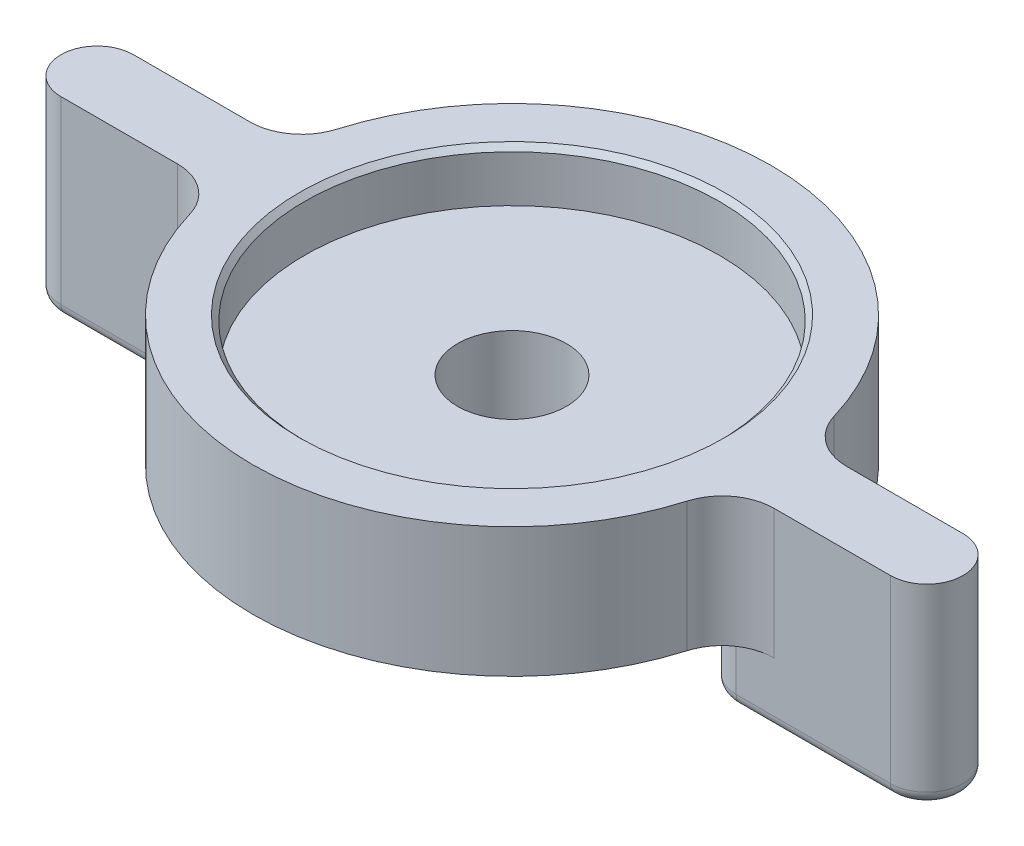
ISO-10303-21;
HEADER;
FILE_DESCRIPTION(('STEP AP214'),'2;1');
FILE_NAME('part.step','',(''),(''),'','','');
FILE_SCHEMA(('AUTOMOTIVE_DESIGN { 1 0 10303 214 1 1 1 1 }'));
ENDSEC;
DATA;
#1=APPLICATION_CONTEXT('core data for automotive mechanical design processes');
#2=APPLICATION_PROTOCOL_DEFINITION('international standard','automotive_design',2000,#1);
#3=PRODUCT_CONTEXT('',#1,'mechanical');
#4=PRODUCT('Part','Part','',(#3));
#5=PRODUCT_RELATED_PRODUCT_CATEGORY('part','',(#4));
#6=PRODUCT_DEFINITION_FORMATION('','',#4);
#7=PRODUCT_DEFINITION_CONTEXT('part definition',#1,'design');
#8=PRODUCT_DEFINITION('design','',#6,#7);
#9=PRODUCT_DEFINITION_SHAPE('','',#8);
#10=(LENGTH_UNIT() NAMED_UNIT(*) SI_UNIT(.MILLI.,.METRE.));
#11=(NAMED_UNIT(*) PLANE_ANGLE_UNIT() SI_UNIT($,.RADIAN.));
#12=(NAMED_UNIT(*) SI_UNIT($,.STERADIAN.) SOLID_ANGLE_UNIT());
#13=UNCERTAINTY_MEASURE_WITH_UNIT(LENGTH_MEASURE(1.E-05),#10,'distance_accuracy_value','');
#14=(GEOMETRIC_REPRESENTATION_CONTEXT(3) GLOBAL_UNCERTAINTY_ASSIGNED_CONTEXT((#13)) GLOBAL_UNIT_ASSIGNED_CONTEXT((#10,
#11,#12)) REPRESENTATION_CONTEXT('',''));
#15=CARTESIAN_POINT('',(0.,0.,0.));
#16=DIRECTION('',(0.,0.,1.));
#17=DIRECTION('',(1.,0.,0.));
#18=AXIS2_PLACEMENT_3D('',#15,#16,#17);
#19=CARTESIAN_POINT('',(-11.5082579046526,3.,3.4));
#20=DIRECTION('',(0.,-1.,0.));
#21=DIRECTION('',(0.,0.,-1.));
#22=AXIS2_PLACEMENT_3D('',#19,#20,#21);
#23=CYLINDRICAL_SURFACE('',#22,2.);
#24=DIRECTION('',(0.,1.,0.));
#25=VECTOR('',#24,1.);
#26=CARTESIAN_POINT('',(-11.5082579046526,3.,1.4));
#27=LINE('',#26,#25);
#28=CARTESIAN_POINT('',(-11.5082579046526,0.,1.4));
#29=VERTEX_POINT('',#28);
#30=CARTESIAN_POINT('',(-11.5082579046524,5.,1.4));
#31=VERTEX_POINT('',#30);
#32=EDGE_CURVE('E287',#29,#31,#27,.T.);
#33=ORIENTED_EDGE('',*,*,#32,.F.);
#34=CARTESIAN_POINT('',(-11.5082579046526,0.,3.4));
#35=DIRECTION('',(0.,1.,0.));
#36=DIRECTION('',(0.,0.,1.));
#37=AXIS2_PLACEMENT_3D('',#34,#35,#36);
#38=CIRCLE('',#37,2.);
#39=CARTESIAN_POINT('',(-9.59021492054387,0.,2.83333333333334));
#40=VERTEX_POINT('',#39);
#41=EDGE_CURVE('E293',#29,#40,#38,.F.);
#42=ORIENTED_EDGE('',*,*,#41,.T.);
#43=DIRECTION('',(0.,-1.,0.));
#44=VECTOR('',#43,1.);
#45=CARTESIAN_POINT('',(-9.59021492054387,3.,2.83333333333333));
#46=LINE('',#45,#44);
#47=CARTESIAN_POINT('',(-9.59021492054387,5.,2.83333333333334));
#48=VERTEX_POINT('',#47);
#49=EDGE_CURVE('E290',#48,#40,#46,.T.);
#50=ORIENTED_EDGE('',*,*,#49,.F.);
#51=CARTESIAN_POINT('',(-11.5082579046526,5.,3.4));
#52=DIRECTION('',(0.,1.,0.));
#53=DIRECTION('',(0.,0.,1.));
#54=AXIS2_PLACEMENT_3D('',#51,#52,#53);
#55=CIRCLE('',#54,2.);
#56=EDGE_CURVE('E295',#48,#31,#55,.T.);
#57=ORIENTED_EDGE('',*,*,#56,.T.);
#58=EDGE_LOOP('',(#33,#42,#50,#57));
#59=FACE_BOUND('',#58,.T.);
#60=ADVANCED_FACE('F33',(#59),#23,.F.);
#61=CARTESIAN_POINT('',(-11.5082579046526,3.,-3.4));
#62=DIRECTION('',(0.,-1.,0.));
#63=DIRECTION('',(0.,0.,-1.));
#64=AXIS2_PLACEMENT_3D('',#61,#62,#63);
#65=CYLINDRICAL_SURFACE('',#64,2.);
#66=DIRECTION('',(0.,-1.,0.));
#67=VECTOR('',#66,1.);
#68=CARTESIAN_POINT('',(-9.59021492054387,3.,-2.83333333333333));
#69=LINE('',#68,#67);
#70=CARTESIAN_POINT('',(-9.59021492054387,0.,-2.83333333333334));
#71=VERTEX_POINT('',#70);
#72=CARTESIAN_POINT('',(-9.59021492054387,5.,-2.83333333333334));
#73=VERTEX_POINT('',#72);
#74=EDGE_CURVE('E271',#71,#73,#69,.F.);
#75=ORIENTED_EDGE('',*,*,#74,.F.);
#76=CARTESIAN_POINT('',(-11.5082579046526,0.,-3.4));
#77=DIRECTION('',(0.,1.,0.));
#78=DIRECTION('',(0.,0.,1.));
#79=AXIS2_PLACEMENT_3D('',#76,#77,#78);
#80=CIRCLE('',#79,2.);
#81=CARTESIAN_POINT('',(-11.5082579046526,0.,-1.4));
#82=VERTEX_POINT('',#81);
#83=EDGE_CURVE('E280',#71,#82,#80,.F.);
#84=ORIENTED_EDGE('',*,*,#83,.T.);
#85=DIRECTION('',(0.,1.,0.));
#86=VECTOR('',#85,1.);
#87=CARTESIAN_POINT('',(-11.5082579046526,3.,-1.4));
#88=LINE('',#87,#86);
#89=CARTESIAN_POINT('',(-11.5082579046526,5.,-1.4));
#90=VERTEX_POINT('',#89);
#91=EDGE_CURVE('E277',#90,#82,#88,.F.);
#92=ORIENTED_EDGE('',*,*,#91,.F.);
#93=CARTESIAN_POINT('',(-11.5082579046526,5.,-3.4));
#94=DIRECTION('',(0.,1.,0.));
#95=DIRECTION('',(0.,0.,1.));
#96=AXIS2_PLACEMENT_3D('',#93,#94,#95);
#97=CIRCLE('',#96,2.);
#98=EDGE_CURVE('E282',#90,#73,#97,.T.);
#99=ORIENTED_EDGE('',*,*,#98,.T.);
#100=EDGE_LOOP('',(#75,#84,#92,#99));
#101=FACE_BOUND('',#100,.T.);
#102=ADVANCED_FACE('F366',(#101),#65,.F.);
#103=CARTESIAN_POINT('',(11.5082579046526,3.,3.4));
#104=DIRECTION('',(0.,-1.,0.));
#105=DIRECTION('',(0.,0.,-1.));
#106=AXIS2_PLACEMENT_3D('',#103,#104,#105);
#107=CYLINDRICAL_SURFACE('',#106,2.);
#108=DIRECTION('',(0.,1.,0.));
#109=VECTOR('',#108,1.);
#110=CARTESIAN_POINT('',(11.5082579046526,3.,1.4));
#111=LINE('',#110,#109);
#112=CARTESIAN_POINT('',(11.5082579046526,5.,1.4));
#113=VERTEX_POINT('',#112);
#114=CARTESIAN_POINT('',(11.5082579046526,0.,1.4));
#115=VERTEX_POINT('',#114);
#116=EDGE_CURVE('E191',#113,#115,#111,.F.);
#117=ORIENTED_EDGE('',*,*,#116,.F.);
#118=CARTESIAN_POINT('',(11.5082579046526,5.,3.4));
#119=DIRECTION('',(0.,1.,0.));
#120=DIRECTION('',(0.,0.,1.));
#121=AXIS2_PLACEMENT_3D('',#118,#119,#120);
#122=CIRCLE('',#121,2.);
#123=CARTESIAN_POINT('',(9.59021492054387,5.,2.83333333333333));
#124=VERTEX_POINT('',#123);
#125=EDGE_CURVE('E266',#113,#124,#122,.T.);
#126=ORIENTED_EDGE('',*,*,#125,.T.);
#127=DIRECTION('',(0.,-1.,0.));
#128=VECTOR('',#127,1.);
#129=CARTESIAN_POINT('',(9.59021492054387,3.,2.83333333333333));
#130=LINE('',#129,#128);
#131=CARTESIAN_POINT('',(9.59021492054387,0.,2.83333333333333));
#132=VERTEX_POINT('',#131);
#133=EDGE_CURVE('E263',#132,#124,#130,.F.);
#134=ORIENTED_EDGE('',*,*,#133,.F.);
#135=CARTESIAN_POINT('',(11.5082579046526,0.,3.4));
#136=DIRECTION('',(0.,1.,0.));
#137=DIRECTION('',(0.,0.,1.));
#138=AXIS2_PLACEMENT_3D('',#135,#136,#137);
#139=CIRCLE('',#138,2.);
#140=EDGE_CURVE('E269',#132,#115,#139,.F.);
#141=ORIENTED_EDGE('',*,*,#140,.T.);
#142=EDGE_LOOP('',(#117,#126,#134,#141));
#143=FACE_BOUND('',#142,.T.);
#144=ADVANCED_FACE('F372',(#143),#107,.F.);
#145=CARTESIAN_POINT('',(11.5082579046526,3.,-3.4));
#146=DIRECTION('',(0.,-1.,0.));
#147=DIRECTION('',(0.,0.,-1.));
#148=AXIS2_PLACEMENT_3D('',#145,#146,#147);
#149=CYLINDRICAL_SURFACE('',#148,2.);
#150=DIRECTION('',(0.,-1.,0.));
#151=VECTOR('',#150,1.);
#152=CARTESIAN_POINT('',(9.59021492054387,3.,-2.83333333333333));
#153=LINE('',#152,#151);
#154=CARTESIAN_POINT('',(9.59021492054387,5.,-2.83333333333333));
#155=VERTEX_POINT('',#154);
#156=CARTESIAN_POINT('',(9.59021492054387,0.,-2.83333333333333));
#157=VERTEX_POINT('',#156);
#158=EDGE_CURVE('E252',#155,#157,#153,.T.);
#159=ORIENTED_EDGE('',*,*,#158,.F.);
#160=CARTESIAN_POINT('',(11.5082579046526,5.,-3.4));
#161=DIRECTION('',(0.,1.,0.));
#162=DIRECTION('',(0.,0.,1.));
#163=AXIS2_PLACEMENT_3D('',#160,#161,#162);
#164=CIRCLE('',#163,2.);
#165=CARTESIAN_POINT('',(11.5082579046524,5.,-1.4));
#166=VERTEX_POINT('',#165);
#167=EDGE_CURVE('E259',#155,#166,#164,.T.);
#168=ORIENTED_EDGE('',*,*,#167,.T.);
#169=DIRECTION('',(0.,1.,0.));
#170=VECTOR('',#169,1.);
#171=CARTESIAN_POINT('',(11.5082579046526,3.,-1.4));
#172=LINE('',#171,#170);
#173=CARTESIAN_POINT('',(11.5082579046526,0.,-1.4));
#174=VERTEX_POINT('',#173);
#175=EDGE_CURVE('E256',#174,#166,#172,.T.);
#176=ORIENTED_EDGE('',*,*,#175,.F.);
#177=CARTESIAN_POINT('',(11.5082579046526,0.,-3.4));
#178=DIRECTION('',(0.,1.,0.));
#179=DIRECTION('',(0.,0.,1.));
#180=AXIS2_PLACEMENT_3D('',#177,#178,#179);
#181=CIRCLE('',#180,2.);
#182=EDGE_CURVE('E194',#174,#157,#181,.F.);
#183=ORIENTED_EDGE('',*,*,#182,.T.);
#184=EDGE_LOOP('',(#159,#168,#176,#183));
#185=FACE_BOUND('',#184,.T.);
#186=ADVANCED_FACE('F465',(#185),#149,.F.);
#187=CARTESIAN_POINT('',(0.,3.,0.));
#188=DIRECTION('',(0.,1.,0.));
#189=DIRECTION('',(0.,0.,1.));
#190=AXIS2_PLACEMENT_3D('',#187,#188,#189);
#191=PLANE('',#190);
#192=CARTESIAN_POINT('',(0.,3.,0.));
#193=DIRECTION('',(0.,1.,0.));
#194=DIRECTION('',(0.,0.,1.));
#195=AXIS2_PLACEMENT_3D('',#192,#193,#194);
#196=CIRCLE('',#195,2.1);
#197=CARTESIAN_POINT('',(0.,3.,2.1));
#198=VERTEX_POINT('',#197);
#199=EDGE_CURVE('E241',#198,#198,#196,.T.);
#200=ORIENTED_EDGE('',*,*,#199,.F.);
#201=EDGE_LOOP('',(#200));
#202=FACE_BOUND('',#201,.T.);
#203=CARTESIAN_POINT('',(0.,3.,0.));
#204=DIRECTION('',(0.,1.,0.));
#205=DIRECTION('',(0.,0.,1.));
#206=AXIS2_PLACEMENT_3D('',#203,#204,#205);
#207=CIRCLE('',#206,8.);
#208=CARTESIAN_POINT('',(0.,3.,8.));
#209=VERTEX_POINT('',#208);
#210=EDGE_CURVE('E249',#209,#209,#207,.F.);
#211=ORIENTED_EDGE('',*,*,#210,.F.);
#212=EDGE_LOOP('',(#211));
#213=FACE_BOUND('',#212,.T.);
#214=ADVANCED_FACE('F462',(#202,#213),#191,.T.);
#215=CARTESIAN_POINT('',(0.,0.,0.));
#216=DIRECTION('',(0.,1.,0.));
#217=DIRECTION('',(0.,0.,1.));
#218=AXIS2_PLACEMENT_3D('',#215,#216,#217);
#219=PLANE('',#218);
#220=CARTESIAN_POINT('',(-10.05,0.,0.));
#221=DIRECTION('',(0.,-1.,0.));
#222=DIRECTION('',(0.,0.,-1.));
#223=AXIS2_PLACEMENT_3D('',#220,#221,#222);
#224=CIRCLE('',#223,1.4);
#225=CARTESIAN_POINT('',(-10.05,0.,-1.4));
#226=VERTEX_POINT('',#225);
#227=CARTESIAN_POINT('',(-10.05,0.,1.4));
#228=VERTEX_POINT('',#227);
#229=EDGE_CURVE('E209',#226,#228,#224,.T.);
#230=ORIENTED_EDGE('',*,*,#229,.F.);
#231=DIRECTION('',(1.,0.,0.));
#232=VECTOR('',#231,1.);
#233=CARTESIAN_POINT('',(0.,0.,-1.4));
#234=LINE('',#233,#232);
#235=EDGE_CURVE('E274',#82,#226,#234,.T.);
#236=ORIENTED_EDGE('',*,*,#235,.F.);
#237=ORIENTED_EDGE('',*,*,#83,.F.);
#238=CARTESIAN_POINT('',(0.,0.,0.));
#239=DIRECTION('',(0.,1.,0.));
#240=DIRECTION('',(0.,0.,1.));
#241=AXIS2_PLACEMENT_3D('',#238,#239,#240);
#242=CIRCLE('',#241,10.);
#243=EDGE_CURVE('E244',#157,#71,#242,.T.);
#244=ORIENTED_EDGE('',*,*,#243,.F.);
#245=ORIENTED_EDGE('',*,*,#182,.F.);
#246=DIRECTION('',(1.,0.,0.));
#247=VECTOR('',#246,1.);
#248=CARTESIAN_POINT('',(0.,0.,-1.4));
#249=LINE('',#248,#247);
#250=CARTESIAN_POINT('',(10.05,0.,-1.4));
#251=VERTEX_POINT('',#250);
#252=EDGE_CURVE('E201',#251,#174,#249,.T.);
#253=ORIENTED_EDGE('',*,*,#252,.F.);
#254=CARTESIAN_POINT('',(10.05,0.,0.));
#255=DIRECTION('',(0.,-1.,0.));
#256=DIRECTION('',(0.,0.,1.));
#257=AXIS2_PLACEMENT_3D('',#254,#255,#256);
#258=CIRCLE('',#257,1.4);
#259=CARTESIAN_POINT('',(10.05,0.,1.4));
#260=VERTEX_POINT('',#259);
#261=EDGE_CURVE('E178',#260,#251,#258,.T.);
#262=ORIENTED_EDGE('',*,*,#261,.F.);
#263=DIRECTION('',(-1.,0.,0.));
#264=VECTOR('',#263,1.);
#265=CARTESIAN_POINT('',(0.,0.,1.4));
#266=LINE('',#265,#264);
#267=EDGE_CURVE('E187',#115,#260,#266,.T.);
#268=ORIENTED_EDGE('',*,*,#267,.F.);
#269=ORIENTED_EDGE('',*,*,#140,.F.);
#270=EDGE_CURVE('E247',#40,#132,#242,.T.);
#271=ORIENTED_EDGE('',*,*,#270,.F.);
#272=ORIENTED_EDGE('',*,*,#41,.F.);
#273=DIRECTION('',(-1.,0.,0.));
#274=VECTOR('',#273,1.);
#275=CARTESIAN_POINT('',(0.,0.,1.4));
#276=LINE('',#275,#274);
#277=EDGE_CURVE('E284',#228,#29,#276,.T.);
#278=ORIENTED_EDGE('',*,*,#277,.F.);
#279=EDGE_LOOP('',(#230,#236,#237,#244,#245,#253,#262,#268,#269,#271,#272,#278));
#280=FACE_BOUND('',#279,.T.);
#281=CARTESIAN_POINT('',(0.,0.,0.));
#282=DIRECTION('',(0.,1.,0.));
#283=DIRECTION('',(0.,0.,1.));
#284=AXIS2_PLACEMENT_3D('',#281,#282,#283);
#285=CIRCLE('',#284,2.1);
#286=CARTESIAN_POINT('',(0.,0.,2.1));
#287=VERTEX_POINT('',#286);
#288=EDGE_CURVE('E240',#287,#287,#285,.T.);
#289=ORIENTED_EDGE('',*,*,#288,.T.);
#290=EDGE_LOOP('',(#289));
#291=FACE_BOUND('',#290,.T.);
#292=ADVANCED_FACE('F198',(#280,#291),#219,.F.);
#293=CARTESIAN_POINT('',(0.,3.,0.));
#294=DIRECTION('',(0.,-1.,0.));
#295=DIRECTION('',(0.,0.,-1.));
#296=AXIS2_PLACEMENT_3D('',#293,#294,#295);
#297=CYLINDRICAL_SURFACE('',#296,10.);
#298=CARTESIAN_POINT('',(0.,5.,0.));
#299=DIRECTION('',(0.,1.,0.));
#300=DIRECTION('',(0.,0.,1.));
#301=AXIS2_PLACEMENT_3D('',#298,#299,#300);
#302=CIRCLE('',#301,10.);
#303=EDGE_CURVE('E205',#48,#124,#302,.T.);
#304=ORIENTED_EDGE('',*,*,#303,.F.);
#305=ORIENTED_EDGE('',*,*,#49,.T.);
#306=ORIENTED_EDGE('',*,*,#270,.T.);
#307=ORIENTED_EDGE('',*,*,#133,.T.);
#308=EDGE_LOOP('',(#304,#305,#306,#307));
#309=FACE_BOUND('',#308,.T.);
#310=ADVANCED_FACE('F469',(#309),#297,.T.);
#311=ORIENTED_EDGE('',*,*,#243,.T.);
#312=ORIENTED_EDGE('',*,*,#74,.T.);
#313=EDGE_CURVE('E202',#155,#73,#302,.T.);
#314=ORIENTED_EDGE('',*,*,#313,.F.);
#315=ORIENTED_EDGE('',*,*,#158,.T.);
#316=EDGE_LOOP('',(#311,#312,#314,#315));
#317=FACE_BOUND('',#316,.T.);
#318=ADVANCED_FACE('F460',(#317),#297,.T.);
#319=CARTESIAN_POINT('',(0.,3.,0.));
#320=DIRECTION('',(0.,-1.,0.));
#321=DIRECTION('',(0.,0.,-1.));
#322=AXIS2_PLACEMENT_3D('',#319,#320,#321);
#323=CYLINDRICAL_SURFACE('',#322,2.1);
#324=ORIENTED_EDGE('',*,*,#199,.T.);
#325=EDGE_LOOP('',(#324));
#326=FACE_BOUND('',#325,.T.);
#327=ORIENTED_EDGE('',*,*,#288,.F.);
#328=EDGE_LOOP('',(#327));
#329=FACE_BOUND('',#328,.T.);
#330=ADVANCED_FACE('F457',(#326,#329),#323,.F.);
#331=CARTESIAN_POINT('',(-9.90151503558925,5.,-1.4));
#332=DIRECTION('',(0.,0.,1.));
#333=DIRECTION('',(1.,0.,0.));
#334=AXIS2_PLACEMENT_3D('',#331,#332,#333);
#335=PLANE('',#334);
#336=DIRECTION('',(0.,1.,0.));
#337=VECTOR('',#336,1.);
#338=CARTESIAN_POINT('',(-10.05,-2.45,-1.4));
#339=LINE('',#338,#337);
#340=CARTESIAN_POINT('',(-10.05,-1.95,-1.4));
#341=VERTEX_POINT('',#340);
#342=EDGE_CURVE('E212',#341,#226,#339,.T.);
#343=ORIENTED_EDGE('',*,*,#342,.F.);
#344=DIRECTION('',(1.,0.,0.));
#345=VECTOR('',#344,1.);
#346=CARTESIAN_POINT('',(-16.,-1.95,-1.4));
#347=LINE('',#346,#345);
#348=CARTESIAN_POINT('',(-16.,-1.95,-1.4));
#349=VERTEX_POINT('',#348);
#350=EDGE_CURVE('E56',#341,#349,#347,.F.);
#351=ORIENTED_EDGE('',*,*,#350,.T.);
#352=DIRECTION('',(0.,-1.,0.));
#353=VECTOR('',#352,1.);
#354=CARTESIAN_POINT('',(-16.,5.,-1.4));
#355=LINE('',#354,#353);
#356=CARTESIAN_POINT('',(-16.,5.,-1.4));
#357=VERTEX_POINT('',#356);
#358=EDGE_CURVE('E238',#357,#349,#355,.T.);
#359=ORIENTED_EDGE('',*,*,#358,.F.);
#360=DIRECTION('',(-1.,0.,0.));
#361=VECTOR('',#360,1.);
#362=CARTESIAN_POINT('',(-9.90151503558925,5.,-1.4));
#363=LINE('',#362,#361);
#364=EDGE_CURVE('E229',#90,#357,#363,.T.);
#365=ORIENTED_EDGE('',*,*,#364,.F.);
#366=ORIENTED_EDGE('',*,*,#91,.T.);
#367=ORIENTED_EDGE('',*,*,#235,.T.);
#368=EDGE_LOOP('',(#343,#351,#359,#365,#366,#367));
#369=FACE_BOUND('',#368,.T.);
#370=ADVANCED_FACE('F454',(#369),#335,.F.);
#371=CARTESIAN_POINT('',(-16.,5.,0.));
#372=DIRECTION('',(0.,-1.,0.));
#373=DIRECTION('',(0.,0.,-1.));
#374=AXIS2_PLACEMENT_3D('',#371,#372,#373);
#375=CYLINDRICAL_SURFACE('',#374,1.4);
#376=ORIENTED_EDGE('',*,*,#358,.T.);
#377=CARTESIAN_POINT('',(-16.,-1.95,0.));
#378=DIRECTION('',(0.,-1.,0.));
#379=DIRECTION('',(0.,0.,-1.));
#380=AXIS2_PLACEMENT_3D('',#377,#378,#379);
#381=CIRCLE('',#380,1.4);
#382=CARTESIAN_POINT('',(-16.,-1.95,1.4));
#383=VERTEX_POINT('',#382);
#384=EDGE_CURVE('E48',#349,#383,#381,.F.);
#385=ORIENTED_EDGE('',*,*,#384,.T.);
#386=DIRECTION('',(0.,-1.,0.));
#387=VECTOR('',#386,1.);
#388=CARTESIAN_POINT('',(-16.,5.,1.4));
#389=LINE('',#388,#387);
#390=CARTESIAN_POINT('',(-16.,5.,1.4));
#391=VERTEX_POINT('',#390);
#392=EDGE_CURVE('E236',#391,#383,#389,.T.);
#393=ORIENTED_EDGE('',*,*,#392,.F.);
#394=CARTESIAN_POINT('',(-16.,5.,0.));
#395=DIRECTION('',(0.,1.,0.));
#396=DIRECTION('',(0.,0.,1.));
#397=AXIS2_PLACEMENT_3D('',#394,#395,#396);
#398=CIRCLE('',#397,1.4);
#399=EDGE_CURVE('E231',#357,#391,#398,.T.);
#400=ORIENTED_EDGE('',*,*,#399,.F.);
#401=EDGE_LOOP('',(#376,#385,#393,#400));
#402=FACE_BOUND('',#401,.T.);
#403=ADVANCED_FACE('F451',(#402),#375,.T.);
#404=CARTESIAN_POINT('',(-9.90151503558925,5.,1.4));
#405=DIRECTION('',(0.,0.,-1.));
#406=DIRECTION('',(-1.,0.,0.));
#407=AXIS2_PLACEMENT_3D('',#404,#405,#406);
#408=PLANE('',#407);
#409=ORIENTED_EDGE('',*,*,#392,.T.);
#410=DIRECTION('',(-1.,0.,0.));
#411=VECTOR('',#410,1.);
#412=CARTESIAN_POINT('',(-10.05,-1.95,1.4));
#413=LINE('',#412,#411);
#414=CARTESIAN_POINT('',(-10.05,-1.95,1.4));
#415=VERTEX_POINT('',#414);
#416=EDGE_CURVE('E328',#383,#415,#413,.F.);
#417=ORIENTED_EDGE('',*,*,#416,.T.);
#418=DIRECTION('',(0.,1.,0.));
#419=VECTOR('',#418,1.);
#420=CARTESIAN_POINT('',(-10.05,-2.45,1.4));
#421=LINE('',#420,#419);
#422=EDGE_CURVE('E214',#415,#228,#421,.T.);
#423=ORIENTED_EDGE('',*,*,#422,.T.);
#424=ORIENTED_EDGE('',*,*,#277,.T.);
#425=ORIENTED_EDGE('',*,*,#32,.T.);
#426=DIRECTION('',(1.,0.,0.));
#427=VECTOR('',#426,1.);
#428=CARTESIAN_POINT('',(-9.90151503558925,5.,1.4));
#429=LINE('',#428,#427);
#430=EDGE_CURVE('E233',#391,#31,#429,.T.);
#431=ORIENTED_EDGE('',*,*,#430,.F.);
#432=EDGE_LOOP('',(#409,#417,#423,#424,#425,#431));
#433=FACE_BOUND('',#432,.T.);
#434=ADVANCED_FACE('F413',(#433),#408,.F.);
#435=CARTESIAN_POINT('',(-9.90151503558925,5.,0.));
#436=DIRECTION('',(0.,1.,0.));
#437=DIRECTION('',(0.,0.,1.));
#438=AXIS2_PLACEMENT_3D('',#435,#436,#437);
#439=PLANE('',#438);
#440=CARTESIAN_POINT('',(0.,5.,0.));
#441=DIRECTION('',(0.,1.,0.));
#442=DIRECTION('',(0.,0.,1.));
#443=AXIS2_PLACEMENT_3D('',#440,#441,#442);
#444=CIRCLE('',#443,8.19999999999999);
#445=CARTESIAN_POINT('',(0.,5.,8.19999999999999));
#446=VERTEX_POINT('',#445);
#447=EDGE_CURVE('E12',#446,#446,#444,.F.);
#448=ORIENTED_EDGE('',*,*,#447,.T.);
#449=EDGE_LOOP('',(#448));
#450=FACE_BOUND('',#449,.T.);
#451=ORIENTED_EDGE('',*,*,#56,.F.);
#452=ORIENTED_EDGE('',*,*,#303,.T.);
#453=ORIENTED_EDGE('',*,*,#125,.F.);
#454=DIRECTION('',(1.,0.,0.));
#455=VECTOR('',#454,1.);
#456=CARTESIAN_POINT('',(9.90151503558925,5.,1.4));
#457=LINE('',#456,#455);
#458=CARTESIAN_POINT('',(16.,5.,1.4));
#459=VERTEX_POINT('',#458);
#460=EDGE_CURVE('E216',#113,#459,#457,.T.);
#461=ORIENTED_EDGE('',*,*,#460,.T.);
#462=CARTESIAN_POINT('',(16.,5.,0.));
#463=DIRECTION('',(0.,1.,0.));
#464=DIRECTION('',(0.,0.,-1.));
#465=AXIS2_PLACEMENT_3D('',#462,#463,#464);
#466=CIRCLE('',#465,1.4);
#467=CARTESIAN_POINT('',(16.,5.,-1.4));
#468=VERTEX_POINT('',#467);
#469=EDGE_CURVE('E218',#459,#468,#466,.T.);
#470=ORIENTED_EDGE('',*,*,#469,.T.);
#471=DIRECTION('',(-1.,0.,0.));
#472=VECTOR('',#471,1.);
#473=CARTESIAN_POINT('',(9.90151503558925,5.,-1.4));
#474=LINE('',#473,#472);
#475=EDGE_CURVE('E220',#468,#166,#474,.T.);
#476=ORIENTED_EDGE('',*,*,#475,.T.);
#477=ORIENTED_EDGE('',*,*,#167,.F.);
#478=ORIENTED_EDGE('',*,*,#313,.T.);
#479=ORIENTED_EDGE('',*,*,#98,.F.);
#480=ORIENTED_EDGE('',*,*,#364,.T.);
#481=ORIENTED_EDGE('',*,*,#399,.T.);
#482=ORIENTED_EDGE('',*,*,#430,.T.);
#483=EDGE_LOOP('',(#451,#452,#453,#461,#470,#476,#477,#478,#479,#480,#481,#482));
#484=FACE_BOUND('',#483,.T.);
#485=ADVANCED_FACE('F445',(#450,#484),#439,.T.);
#486=CARTESIAN_POINT('',(9.90151503558925,5.,1.4));
#487=DIRECTION('',(0.,0.,-1.));
#488=DIRECTION('',(-1.,0.,0.));
#489=AXIS2_PLACEMENT_3D('',#486,#487,#488);
#490=PLANE('',#489);
#491=DIRECTION('',(0.,1.,0.));
#492=VECTOR('',#491,1.);
#493=CARTESIAN_POINT('',(10.05,-2.45,1.4));
#494=LINE('',#493,#492);
#495=CARTESIAN_POINT('',(10.05,-1.95,1.4));
#496=VERTEX_POINT('',#495);
#497=EDGE_CURVE('E173',#496,#260,#494,.T.);
#498=ORIENTED_EDGE('',*,*,#497,.F.);
#499=DIRECTION('',(-1.,0.,0.));
#500=VECTOR('',#499,1.);
#501=CARTESIAN_POINT('',(9.90151503558925,-1.95,1.4));
#502=LINE('',#501,#500);
#503=CARTESIAN_POINT('',(16.,-1.95,1.4));
#504=VERTEX_POINT('',#503);
#505=EDGE_CURVE('E326',#496,#504,#502,.F.);
#506=ORIENTED_EDGE('',*,*,#505,.T.);
#507=DIRECTION('',(0.,-1.,0.));
#508=VECTOR('',#507,1.);
#509=CARTESIAN_POINT('',(16.,5.,1.4));
#510=LINE('',#509,#508);
#511=EDGE_CURVE('E226',#459,#504,#510,.T.);
#512=ORIENTED_EDGE('',*,*,#511,.F.);
#513=ORIENTED_EDGE('',*,*,#460,.F.);
#514=ORIENTED_EDGE('',*,*,#116,.T.);
#515=ORIENTED_EDGE('',*,*,#267,.T.);
#516=EDGE_LOOP('',(#498,#506,#512,#513,#514,#515));
#517=FACE_BOUND('',#516,.T.);
#518=ADVANCED_FACE('F188',(#517),#490,.F.);
#519=CARTESIAN_POINT('',(16.,5.,0.));
#520=DIRECTION('',(0.,-1.,0.));
#521=DIRECTION('',(0.,0.,-1.));
#522=AXIS2_PLACEMENT_3D('',#519,#520,#521);
#523=CYLINDRICAL_SURFACE('',#522,1.4);
#524=ORIENTED_EDGE('',*,*,#511,.T.);
#525=CARTESIAN_POINT('',(16.,-1.95,0.));
#526=DIRECTION('',(0.,1.,0.));
#527=DIRECTION('',(0.,0.,1.));
#528=AXIS2_PLACEMENT_3D('',#525,#526,#527);
#529=CIRCLE('',#528,1.4);
#530=CARTESIAN_POINT('',(16.,-1.95,-1.4));
#531=VERTEX_POINT('',#530);
#532=EDGE_CURVE('E306',#504,#531,#529,.T.);
#533=ORIENTED_EDGE('',*,*,#532,.T.);
#534=DIRECTION('',(0.,-1.,0.));
#535=VECTOR('',#534,1.);
#536=CARTESIAN_POINT('',(16.,5.,-1.4));
#537=LINE('',#536,#535);
#538=EDGE_CURVE('E223',#468,#531,#537,.T.);
#539=ORIENTED_EDGE('',*,*,#538,.F.);
#540=ORIENTED_EDGE('',*,*,#469,.F.);
#541=EDGE_LOOP('',(#524,#533,#539,#540));
#542=FACE_BOUND('',#541,.T.);
#543=ADVANCED_FACE('F438',(#542),#523,.T.);
#544=CARTESIAN_POINT('',(9.90151503558925,5.,-1.4));
#545=DIRECTION('',(0.,0.,1.));
#546=DIRECTION('',(1.,0.,0.));
#547=AXIS2_PLACEMENT_3D('',#544,#545,#546);
#548=PLANE('',#547);
#549=ORIENTED_EDGE('',*,*,#538,.T.);
#550=DIRECTION('',(1.,0.,0.));
#551=VECTOR('',#550,1.);
#552=CARTESIAN_POINT('',(9.90151503558925,-1.95,-1.4));
#553=LINE('',#552,#551);
#554=CARTESIAN_POINT('',(10.05,-1.95,-1.4));
#555=VERTEX_POINT('',#554);
#556=EDGE_CURVE('E309',#531,#555,#553,.F.);
#557=ORIENTED_EDGE('',*,*,#556,.T.);
#558=DIRECTION('',(0.,1.,0.));
#559=VECTOR('',#558,1.);
#560=CARTESIAN_POINT('',(10.05,-2.45,-1.4));
#561=LINE('',#560,#559);
#562=EDGE_CURVE('E183',#555,#251,#561,.T.);
#563=ORIENTED_EDGE('',*,*,#562,.T.);
#564=ORIENTED_EDGE('',*,*,#252,.T.);
#565=ORIENTED_EDGE('',*,*,#175,.T.);
#566=ORIENTED_EDGE('',*,*,#475,.F.);
#567=EDGE_LOOP('',(#549,#557,#563,#564,#565,#566));
#568=FACE_BOUND('',#567,.T.);
#569=ADVANCED_FACE('F432',(#568),#548,.F.);
#570=CARTESIAN_POINT('',(-10.05,-2.45,0.));
#571=DIRECTION('',(0.,1.,0.));
#572=DIRECTION('',(0.,0.,1.));
#573=AXIS2_PLACEMENT_3D('',#570,#571,#572);
#574=CYLINDRICAL_SURFACE('',#573,1.4);
#575=ORIENTED_EDGE('',*,*,#422,.F.);
#576=CARTESIAN_POINT('',(-10.05,-1.95,0.));
#577=DIRECTION('',(0.,-1.,0.));
#578=DIRECTION('',(0.,0.,-1.));
#579=AXIS2_PLACEMENT_3D('',#576,#577,#578);
#580=CIRCLE('',#579,1.4);
#581=EDGE_CURVE('E321',#415,#341,#580,.F.);
#582=ORIENTED_EDGE('',*,*,#581,.T.);
#583=ORIENTED_EDGE('',*,*,#342,.T.);
#584=ORIENTED_EDGE('',*,*,#229,.T.);
#585=EDGE_LOOP('',(#575,#582,#583,#584));
#586=FACE_BOUND('',#585,.T.);
#587=ADVANCED_FACE('F418',(#586),#574,.T.);
#588=CARTESIAN_POINT('',(-10.05,-2.45,0.));
#589=DIRECTION('',(0.,-1.,0.));
#590=DIRECTION('',(0.,0.,-1.));
#591=AXIS2_PLACEMENT_3D('',#588,#589,#590);
#592=PLANE('',#591);
#593=DIRECTION('',(1.,0.,0.));
#594=VECTOR('',#593,1.);
#595=CARTESIAN_POINT('',(-10.05,-2.45,-0.9));
#596=LINE('',#595,#594);
#597=CARTESIAN_POINT('',(-16.,-2.45,-0.9));
#598=VERTEX_POINT('',#597);
#599=CARTESIAN_POINT('',(-10.05,-2.45,-0.9));
#600=VERTEX_POINT('',#599);
#601=EDGE_CURVE('E316',#598,#600,#596,.T.);
#602=ORIENTED_EDGE('',*,*,#601,.T.);
#603=CARTESIAN_POINT('',(-10.05,-2.45,0.));
#604=DIRECTION('',(0.,-1.,0.));
#605=DIRECTION('',(0.,0.,-1.));
#606=AXIS2_PLACEMENT_3D('',#603,#604,#605);
#607=CIRCLE('',#606,0.900000000000002);
#608=CARTESIAN_POINT('',(-10.05,-2.45,0.9));
#609=VERTEX_POINT('',#608);
#610=EDGE_CURVE('E318',#600,#609,#607,.T.);
#611=ORIENTED_EDGE('',*,*,#610,.T.);
#612=DIRECTION('',(-1.,0.,0.));
#613=VECTOR('',#612,1.);
#614=CARTESIAN_POINT('',(-16.,-2.45,0.9));
#615=LINE('',#614,#613);
#616=CARTESIAN_POINT('',(-16.,-2.45,0.9));
#617=VERTEX_POINT('',#616);
#618=EDGE_CURVE('E312',#609,#617,#615,.T.);
#619=ORIENTED_EDGE('',*,*,#618,.T.);
#620=CARTESIAN_POINT('',(-16.,-2.45,0.));
#621=DIRECTION('',(0.,-1.,0.));
#622=DIRECTION('',(0.,0.,-1.));
#623=AXIS2_PLACEMENT_3D('',#620,#621,#622);
#624=CIRCLE('',#623,0.9);
#625=EDGE_CURVE('E314',#617,#598,#624,.T.);
#626=ORIENTED_EDGE('',*,*,#625,.T.);
#627=EDGE_LOOP('',(#602,#611,#619,#626));
#628=FACE_BOUND('',#627,.T.);
#629=ADVANCED_FACE('F423',(#628),#592,.T.);
#630=CARTESIAN_POINT('',(10.05,-2.45,0.));
#631=DIRECTION('',(0.,1.,0.));
#632=DIRECTION('',(0.,0.,1.));
#633=AXIS2_PLACEMENT_3D('',#630,#631,#632);
#634=CYLINDRICAL_SURFACE('',#633,1.4);
#635=ORIENTED_EDGE('',*,*,#562,.F.);
#636=CARTESIAN_POINT('',(10.05,-1.95,0.));
#637=DIRECTION('',(0.,1.,0.));
#638=DIRECTION('',(0.,0.,1.));
#639=AXIS2_PLACEMENT_3D('',#636,#637,#638);
#640=CIRCLE('',#639,1.4);
#641=EDGE_CURVE('E180',#555,#496,#640,.T.);
#642=ORIENTED_EDGE('',*,*,#641,.T.);
#643=ORIENTED_EDGE('',*,*,#497,.T.);
#644=ORIENTED_EDGE('',*,*,#261,.T.);
#645=EDGE_LOOP('',(#635,#642,#643,#644));
#646=FACE_BOUND('',#645,.T.);
#647=ADVANCED_FACE('F176',(#646),#634,.T.);
#648=CARTESIAN_POINT('',(10.05,-2.45,0.));
#649=DIRECTION('',(0.,1.,0.));
#650=DIRECTION('',(0.,0.,1.));
#651=AXIS2_PLACEMENT_3D('',#648,#649,#650);
#652=PLANE('',#651);
#653=DIRECTION('',(1.,0.,0.));
#654=VECTOR('',#653,1.);
#655=CARTESIAN_POINT('',(10.05,-2.45,-0.9));
#656=LINE('',#655,#654);
#657=CARTESIAN_POINT('',(10.05,-2.45,-0.899999999999999));
#658=VERTEX_POINT('',#657);
#659=CARTESIAN_POINT('',(16.,-2.45,-0.9));
#660=VERTEX_POINT('',#659);
#661=EDGE_CURVE('E301',#658,#660,#656,.T.);
#662=ORIENTED_EDGE('',*,*,#661,.T.);
#663=CARTESIAN_POINT('',(16.,-2.45,0.));
#664=DIRECTION('',(0.,1.,0.));
#665=DIRECTION('',(0.,0.,1.));
#666=AXIS2_PLACEMENT_3D('',#663,#664,#665);
#667=CIRCLE('',#666,0.9);
#668=CARTESIAN_POINT('',(16.,-2.45,0.9));
#669=VERTEX_POINT('',#668);
#670=EDGE_CURVE('E303',#660,#669,#667,.F.);
#671=ORIENTED_EDGE('',*,*,#670,.T.);
#672=DIRECTION('',(-1.,0.,0.));
#673=VECTOR('',#672,1.);
#674=CARTESIAN_POINT('',(10.05,-2.45,0.9));
#675=LINE('',#674,#673);
#676=CARTESIAN_POINT('',(10.05,-2.45,0.9));
#677=VERTEX_POINT('',#676);
#678=EDGE_CURVE('E297',#669,#677,#675,.T.);
#679=ORIENTED_EDGE('',*,*,#678,.T.);
#680=CARTESIAN_POINT('',(10.05,-2.45,0.));
#681=DIRECTION('',(0.,1.,0.));
#682=DIRECTION('',(0.,0.,1.));
#683=AXIS2_PLACEMENT_3D('',#680,#681,#682);
#684=CIRCLE('',#683,0.900000000000002);
#685=EDGE_CURVE('E299',#677,#658,#684,.F.);
#686=ORIENTED_EDGE('',*,*,#685,.T.);
#687=EDGE_LOOP('',(#662,#671,#679,#686));
#688=FACE_BOUND('',#687,.T.);
#689=ADVANCED_FACE('F430',(#688),#652,.F.);
#690=CARTESIAN_POINT('',(0.,5.,0.));
#691=DIRECTION('',(0.,-1.,0.));
#692=DIRECTION('',(0.,0.,-1.));
#693=AXIS2_PLACEMENT_3D('',#690,#691,#692);
#694=CYLINDRICAL_SURFACE('',#693,8.);
#695=CARTESIAN_POINT('',(0.,4.8,0.));
#696=DIRECTION('',(0.,1.,0.));
#697=DIRECTION('',(0.,0.,1.));
#698=AXIS2_PLACEMENT_3D('',#695,#696,#697);
#699=CIRCLE('',#698,8.);
#700=CARTESIAN_POINT('',(0.,4.8,8.));
#701=VERTEX_POINT('',#700);
#702=EDGE_CURVE('E41',#701,#701,#699,.T.);
#703=ORIENTED_EDGE('',*,*,#702,.T.);
#704=EDGE_LOOP('',(#703));
#705=FACE_BOUND('',#704,.T.);
#706=ORIENTED_EDGE('',*,*,#210,.T.);
#707=EDGE_LOOP('',(#706));
#708=FACE_BOUND('',#707,.T.);
#709=ADVANCED_FACE('F352',(#705,#708),#694,.F.);
#710=CARTESIAN_POINT('',(10.05,-1.95,0.));
#711=DIRECTION('',(0.,1.,0.));
#712=DIRECTION('',(0.,0.,1.));
#713=AXIS2_PLACEMENT_3D('',#710,#711,#712);
#714=TOROIDAL_SURFACE('',#713,0.900000000000002,0.5);
#715=CARTESIAN_POINT('',(10.05,-1.95,0.900000000000005));
#716=DIRECTION('',(1.,0.,0.));
#717=DIRECTION('',(0.,0.,-1.));
#718=AXIS2_PLACEMENT_3D('',#715,#716,#717);
#719=CIRCLE('',#718,0.5);
#720=EDGE_CURVE('E335',#496,#677,#719,.T.);
#721=ORIENTED_EDGE('',*,*,#720,.F.);
#722=ORIENTED_EDGE('',*,*,#641,.F.);
#723=CARTESIAN_POINT('',(10.05,-1.95,-0.899999999999999));
#724=DIRECTION('',(1.,0.,0.));
#725=DIRECTION('',(0.,0.,-1.));
#726=AXIS2_PLACEMENT_3D('',#723,#724,#725);
#727=CIRCLE('',#726,0.5);
#728=EDGE_CURVE('E338',#658,#555,#727,.T.);
#729=ORIENTED_EDGE('',*,*,#728,.F.);
#730=ORIENTED_EDGE('',*,*,#685,.F.);
#731=EDGE_LOOP('',(#721,#722,#729,#730));
#732=FACE_BOUND('',#731,.T.);
#733=ADVANCED_FACE('F390',(#732),#714,.T.);
#734=CARTESIAN_POINT('',(10.05,-1.95,-0.9));
#735=DIRECTION('',(1.,0.,0.));
#736=DIRECTION('',(0.,0.,-1.));
#737=AXIS2_PLACEMENT_3D('',#734,#735,#736);
#738=CYLINDRICAL_SURFACE('',#737,0.5);
#739=ORIENTED_EDGE('',*,*,#728,.T.);
#740=ORIENTED_EDGE('',*,*,#556,.F.);
#741=CARTESIAN_POINT('',(16.,-1.95,-0.9));
#742=DIRECTION('',(1.,0.,0.));
#743=DIRECTION('',(0.,0.,-1.));
#744=AXIS2_PLACEMENT_3D('',#741,#742,#743);
#745=CIRCLE('',#744,0.5);
#746=EDGE_CURVE('E332',#660,#531,#745,.T.);
#747=ORIENTED_EDGE('',*,*,#746,.F.);
#748=ORIENTED_EDGE('',*,*,#661,.F.);
#749=EDGE_LOOP('',(#739,#740,#747,#748));
#750=FACE_BOUND('',#749,.T.);
#751=ADVANCED_FACE('F386',(#750),#738,.T.);
#752=CARTESIAN_POINT('',(10.05,-1.95,0.9));
#753=DIRECTION('',(-1.,0.,0.));
#754=DIRECTION('',(0.,0.,1.));
#755=AXIS2_PLACEMENT_3D('',#752,#753,#754);
#756=CYLINDRICAL_SURFACE('',#755,0.5);
#757=ORIENTED_EDGE('',*,*,#720,.T.);
#758=ORIENTED_EDGE('',*,*,#678,.F.);
#759=CARTESIAN_POINT('',(16.,-1.95,0.9));
#760=DIRECTION('',(1.,0.,0.));
#761=DIRECTION('',(0.,0.,-1.));
#762=AXIS2_PLACEMENT_3D('',#759,#760,#761);
#763=CIRCLE('',#762,0.5);
#764=EDGE_CURVE('E330',#504,#669,#763,.T.);
#765=ORIENTED_EDGE('',*,*,#764,.F.);
#766=ORIENTED_EDGE('',*,*,#505,.F.);
#767=EDGE_LOOP('',(#757,#758,#765,#766));
#768=FACE_BOUND('',#767,.T.);
#769=ADVANCED_FACE('F382',(#768),#756,.T.);
#770=CARTESIAN_POINT('',(16.,-1.95,0.));
#771=DIRECTION('',(0.,1.,0.));
#772=DIRECTION('',(0.,0.,1.));
#773=AXIS2_PLACEMENT_3D('',#770,#771,#772);
#774=TOROIDAL_SURFACE('',#773,0.9,0.5);
#775=ORIENTED_EDGE('',*,*,#746,.T.);
#776=ORIENTED_EDGE('',*,*,#532,.F.);
#777=ORIENTED_EDGE('',*,*,#764,.T.);
#778=ORIENTED_EDGE('',*,*,#670,.F.);
#779=EDGE_LOOP('',(#775,#776,#777,#778));
#780=FACE_BOUND('',#779,.T.);
#781=ADVANCED_FACE('F378',(#780),#774,.T.);
#782=CARTESIAN_POINT('',(-16.,-1.95,0.));
#783=DIRECTION('',(0.,-1.,0.));
#784=DIRECTION('',(0.,0.,-1.));
#785=AXIS2_PLACEMENT_3D('',#782,#783,#784);
#786=TOROIDAL_SURFACE('',#785,0.9,0.5);
#787=CARTESIAN_POINT('',(-16.,-1.95,0.9));
#788=DIRECTION('',(1.,0.,0.));
#789=DIRECTION('',(0.,0.,-1.));
#790=AXIS2_PLACEMENT_3D('',#787,#788,#789);
#791=CIRCLE('',#790,0.5);
#792=EDGE_CURVE('E345',#383,#617,#791,.T.);
#793=ORIENTED_EDGE('',*,*,#792,.F.);
#794=ORIENTED_EDGE('',*,*,#384,.F.);
#795=CARTESIAN_POINT('',(-16.,-1.95,-0.9));
#796=DIRECTION('',(1.,0.,0.));
#797=DIRECTION('',(0.,0.,-1.));
#798=AXIS2_PLACEMENT_3D('',#795,#796,#797);
#799=CIRCLE('',#798,0.5);
#800=EDGE_CURVE('E333',#598,#349,#799,.T.);
#801=ORIENTED_EDGE('',*,*,#800,.F.);
#802=ORIENTED_EDGE('',*,*,#625,.F.);
#803=EDGE_LOOP('',(#793,#794,#801,#802));
#804=FACE_BOUND('',#803,.T.);
#805=ADVANCED_FACE('F381',(#804),#786,.T.);
#806=CARTESIAN_POINT('',(-10.05,-1.95,-0.9));
#807=DIRECTION('',(-1.,0.,0.));
#808=DIRECTION('',(0.,0.,1.));
#809=AXIS2_PLACEMENT_3D('',#806,#807,#808);
#810=CYLINDRICAL_SURFACE('',#809,0.5);
#811=ORIENTED_EDGE('',*,*,#800,.T.);
#812=ORIENTED_EDGE('',*,*,#350,.F.);
#813=CARTESIAN_POINT('',(-10.05,-1.95,-0.9));
#814=DIRECTION('',(1.,0.,0.));
#815=DIRECTION('',(0.,0.,-1.));
#816=AXIS2_PLACEMENT_3D('',#813,#814,#815);
#817=CIRCLE('',#816,0.5);
#818=EDGE_CURVE('E343',#600,#341,#817,.T.);
#819=ORIENTED_EDGE('',*,*,#818,.F.);
#820=ORIENTED_EDGE('',*,*,#601,.F.);
#821=EDGE_LOOP('',(#811,#812,#819,#820));
#822=FACE_BOUND('',#821,.T.);
#823=ADVANCED_FACE('F397',(#822),#810,.T.);
#824=CARTESIAN_POINT('',(-10.05,-1.95,0.9));
#825=DIRECTION('',(1.,0.,0.));
#826=DIRECTION('',(0.,0.,-1.));
#827=AXIS2_PLACEMENT_3D('',#824,#825,#826);
#828=CYLINDRICAL_SURFACE('',#827,0.5);
#829=ORIENTED_EDGE('',*,*,#792,.T.);
#830=ORIENTED_EDGE('',*,*,#618,.F.);
#831=CARTESIAN_POINT('',(-10.05,-1.95,0.9));
#832=DIRECTION('',(1.,0.,0.));
#833=DIRECTION('',(0.,0.,-1.));
#834=AXIS2_PLACEMENT_3D('',#831,#832,#833);
#835=CIRCLE('',#834,0.5);
#836=EDGE_CURVE('E341',#415,#609,#835,.T.);
#837=ORIENTED_EDGE('',*,*,#836,.F.);
#838=ORIENTED_EDGE('',*,*,#416,.F.);
#839=EDGE_LOOP('',(#829,#830,#837,#838));
#840=FACE_BOUND('',#839,.T.);
#841=ADVANCED_FACE('F361',(#840),#828,.T.);
#842=CARTESIAN_POINT('',(-10.05,-1.95,0.));
#843=DIRECTION('',(0.,-1.,0.));
#844=DIRECTION('',(0.,0.,-1.));
#845=AXIS2_PLACEMENT_3D('',#842,#843,#844);
#846=TOROIDAL_SURFACE('',#845,0.900000000000002,0.5);
#847=ORIENTED_EDGE('',*,*,#818,.T.);
#848=ORIENTED_EDGE('',*,*,#581,.F.);
#849=ORIENTED_EDGE('',*,*,#836,.T.);
#850=ORIENTED_EDGE('',*,*,#610,.F.);
#851=EDGE_LOOP('',(#847,#848,#849,#850));
#852=FACE_BOUND('',#851,.T.);
#853=ADVANCED_FACE('F356',(#852),#846,.T.);
#854=CARTESIAN_POINT('',(0.,4.8,0.));
#855=DIRECTION('',(0.,1.,0.));
#856=DIRECTION('',(0.,0.,1.));
#857=AXIS2_PLACEMENT_3D('',#854,#855,#856);
#858=CONICAL_SURFACE('',#857,8.,0.785398163397435);
#859=ORIENTED_EDGE('',*,*,#447,.F.);
#860=EDGE_LOOP('',(#859));
#861=FACE_BOUND('',#860,.T.);
#862=ORIENTED_EDGE('',*,*,#702,.F.);
#863=EDGE_LOOP('',(#862));
#864=FACE_BOUND('',#863,.T.);
#865=ADVANCED_FACE('F35',(#861,#864),#858,.F.);
#866=CLOSED_SHELL('',(#60,#102,#144,#186,#214,#292,#310,#318,#330,#370,#403,#434,#485,#518,#543,
#569,#587,#629,#647,#689,#709,#733,#751,#769,#781,#805,#823,#841,#853,#865));
#867=MANIFOLD_SOLID_BREP('B2',#866);
#868=ADVANCED_BREP_SHAPE_REPRESENTATION('',(#18,#867),#14);
#869=SHAPE_DEFINITION_REPRESENTATION(#9,#868);
ENDSEC;
END-ISO-10303-21;
